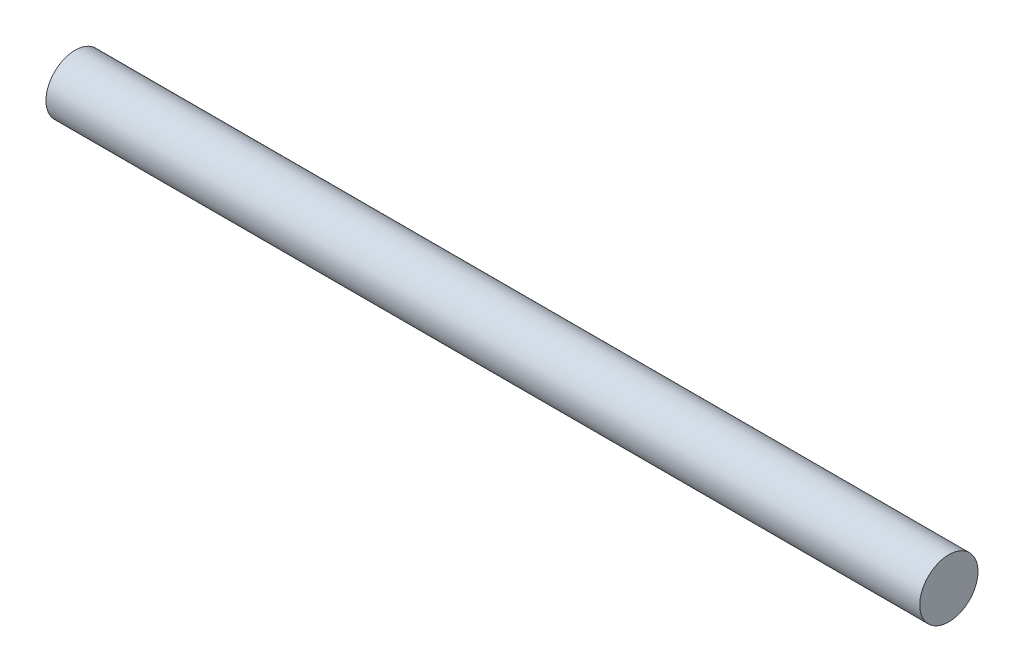
ISO-10303-21;
HEADER;
FILE_DESCRIPTION(('STEP AP214'),'2;1');
FILE_NAME('part.step','',(''),(''),'','','');
FILE_SCHEMA(('AUTOMOTIVE_DESIGN { 1 0 10303 214 1 1 1 1 }'));
ENDSEC;
DATA;
#1=APPLICATION_CONTEXT('core data for automotive mechanical design processes');
#2=APPLICATION_PROTOCOL_DEFINITION('international standard','automotive_design',2000,#1);
#3=PRODUCT_CONTEXT('',#1,'mechanical');
#4=PRODUCT('Part','Part','',(#3));
#5=PRODUCT_RELATED_PRODUCT_CATEGORY('part','',(#4));
#6=PRODUCT_DEFINITION_FORMATION('','',#4);
#7=PRODUCT_DEFINITION_CONTEXT('part definition',#1,'design');
#8=PRODUCT_DEFINITION('design','',#6,#7);
#9=PRODUCT_DEFINITION_SHAPE('','',#8);
#10=(LENGTH_UNIT() NAMED_UNIT(*) SI_UNIT(.MILLI.,.METRE.));
#11=(NAMED_UNIT(*) PLANE_ANGLE_UNIT() SI_UNIT($,.RADIAN.));
#12=(NAMED_UNIT(*) SI_UNIT($,.STERADIAN.) SOLID_ANGLE_UNIT());
#13=UNCERTAINTY_MEASURE_WITH_UNIT(LENGTH_MEASURE(1.E-05),#10,'distance_accuracy_value','');
#14=(GEOMETRIC_REPRESENTATION_CONTEXT(3) GLOBAL_UNCERTAINTY_ASSIGNED_CONTEXT((#13)) GLOBAL_UNIT_ASSIGNED_CONTEXT((#10,
#11,#12)) REPRESENTATION_CONTEXT('',''));
#15=CARTESIAN_POINT('',(0.,0.,0.));
#16=DIRECTION('',(0.,0.,1.));
#17=DIRECTION('',(1.,0.,0.));
#18=AXIS2_PLACEMENT_3D('',#15,#16,#17);
#19=CARTESIAN_POINT('',(150.,0.,0.));
#20=DIRECTION('',(-1.,0.,0.));
#21=DIRECTION('',(0.,0.,1.));
#22=AXIS2_PLACEMENT_3D('',#19,#20,#21);
#23=CYLINDRICAL_SURFACE('',#22,5.);
#24=CARTESIAN_POINT('',(150.,0.,0.));
#25=DIRECTION('',(1.,0.,0.));
#26=DIRECTION('',(0.,0.,-1.));
#27=AXIS2_PLACEMENT_3D('',#24,#25,#26);
#28=CIRCLE('',#27,5.);
#29=CARTESIAN_POINT('',(150.,0.,-5.));
#30=VERTEX_POINT('',#29);
#31=EDGE_CURVE('E10',#30,#30,#28,.T.);
#32=ORIENTED_EDGE('',*,*,#31,.F.);
#33=EDGE_LOOP('',(#32));
#34=FACE_BOUND('',#33,.T.);
#35=CARTESIAN_POINT('',(0.,0.,0.));
#36=DIRECTION('',(1.,0.,0.));
#37=DIRECTION('',(0.,0.,-1.));
#38=AXIS2_PLACEMENT_3D('',#35,#36,#37);
#39=CIRCLE('',#38,5.);
#40=CARTESIAN_POINT('',(0.,0.,-5.));
#41=VERTEX_POINT('',#40);
#42=EDGE_CURVE('E47',#41,#41,#39,.T.);
#43=ORIENTED_EDGE('',*,*,#42,.T.);
#44=EDGE_LOOP('',(#43));
#45=FACE_BOUND('',#44,.T.);
#46=ADVANCED_FACE('F44',(#34,#45),#23,.T.);
#47=CARTESIAN_POINT('',(150.,0.,0.));
#48=DIRECTION('',(1.,0.,0.));
#49=DIRECTION('',(0.,0.,-1.));
#50=AXIS2_PLACEMENT_3D('',#47,#48,#49);
#51=PLANE('',#50);
#52=ORIENTED_EDGE('',*,*,#31,.T.);
#53=EDGE_LOOP('',(#52));
#54=FACE_BOUND('',#53,.T.);
#55=ADVANCED_FACE('F59',(#54),#51,.T.);
#56=CARTESIAN_POINT('',(0.,0.,0.));
#57=DIRECTION('',(1.,0.,0.));
#58=DIRECTION('',(0.,0.,-1.));
#59=AXIS2_PLACEMENT_3D('',#56,#57,#58);
#60=PLANE('',#59);
#61=ORIENTED_EDGE('',*,*,#42,.F.);
#62=EDGE_LOOP('',(#61));
#63=FACE_BOUND('',#62,.T.);
#64=ADVANCED_FACE('F57',(#63),#60,.F.);
#65=CLOSED_SHELL('',(#46,#55,#64));
#66=MANIFOLD_SOLID_BREP('B2',#65);
#67=ADVANCED_BREP_SHAPE_REPRESENTATION('',(#18,#66),#14);
#68=SHAPE_DEFINITION_REPRESENTATION(#9,#67);
ENDSEC;
END-ISO-10303-21;
